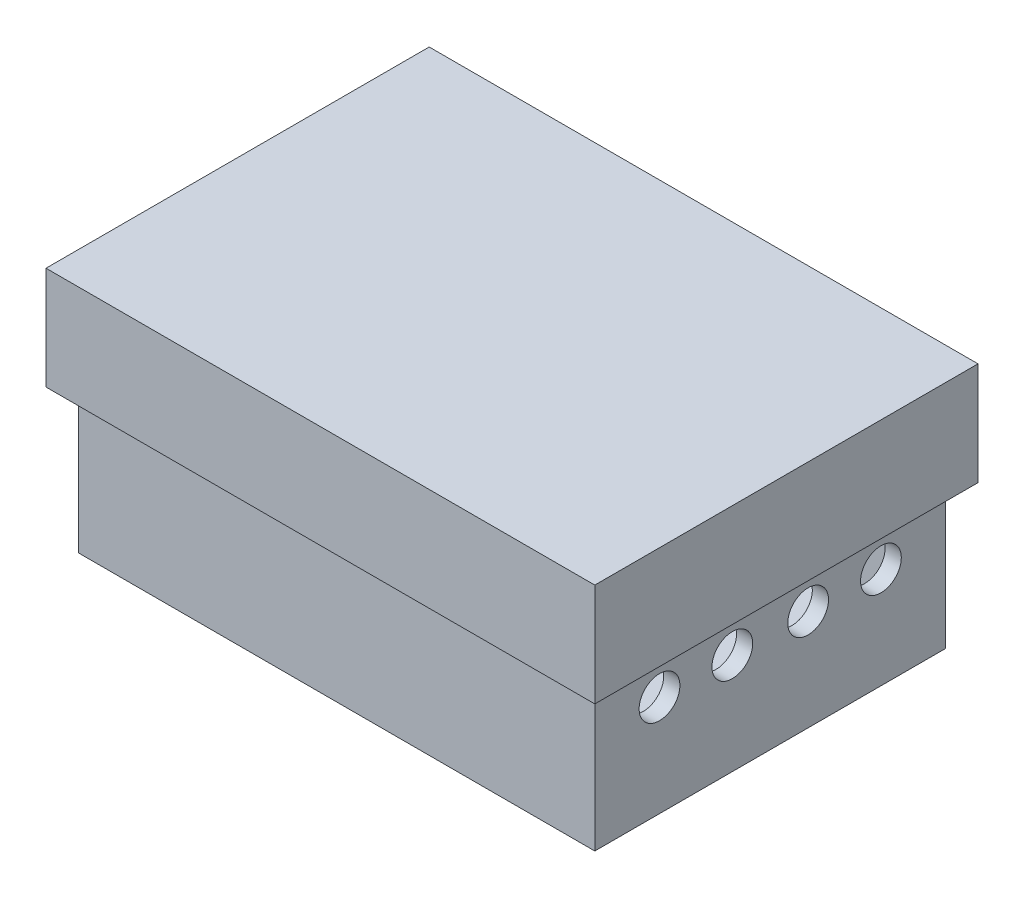
ISO-10303-21;
HEADER;
FILE_DESCRIPTION(('STEP AP214'),'2;1');
FILE_NAME('part.step','',(''),(''),'','','');
FILE_SCHEMA(('AUTOMOTIVE_DESIGN { 1 0 10303 214 1 1 1 1 }'));
ENDSEC;
DATA;
#1=APPLICATION_CONTEXT('core data for automotive mechanical design processes');
#2=APPLICATION_PROTOCOL_DEFINITION('international standard','automotive_design',2000,#1);
#3=PRODUCT_CONTEXT('',#1,'mechanical');
#4=PRODUCT('Part','Part','',(#3));
#5=PRODUCT_RELATED_PRODUCT_CATEGORY('part','',(#4));
#6=PRODUCT_DEFINITION_FORMATION('','',#4);
#7=PRODUCT_DEFINITION_CONTEXT('part definition',#1,'design');
#8=PRODUCT_DEFINITION('design','',#6,#7);
#9=PRODUCT_DEFINITION_SHAPE('','',#8);
#10=(LENGTH_UNIT() NAMED_UNIT(*) SI_UNIT(.MILLI.,.METRE.));
#11=(NAMED_UNIT(*) PLANE_ANGLE_UNIT() SI_UNIT($,.RADIAN.));
#12=(NAMED_UNIT(*) SI_UNIT($,.STERADIAN.) SOLID_ANGLE_UNIT());
#13=UNCERTAINTY_MEASURE_WITH_UNIT(LENGTH_MEASURE(1.E-05),#10,'distance_accuracy_value','');
#14=(GEOMETRIC_REPRESENTATION_CONTEXT(3) GLOBAL_UNCERTAINTY_ASSIGNED_CONTEXT((#13)) GLOBAL_UNIT_ASSIGNED_CONTEXT((#10,
#11,#12)) REPRESENTATION_CONTEXT('',''));
#15=CARTESIAN_POINT('',(0.,0.,0.));
#16=DIRECTION('',(0.,0.,1.));
#17=DIRECTION('',(1.,0.,0.));
#18=AXIS2_PLACEMENT_3D('',#15,#16,#17);
#19=CARTESIAN_POINT('',(101.35,65.,-68.85));
#20=DIRECTION('',(-1.,0.,0.));
#21=DIRECTION('',(0.,0.,1.));
#22=AXIS2_PLACEMENT_3D('',#19,#20,#21);
#23=PLANE('',#22);
#24=CARTESIAN_POINT('',(101.35,33.25,-14.875));
#25=DIRECTION('',(1.,0.,0.));
#26=DIRECTION('',(0.,0.,-1.));
#27=AXIS2_PLACEMENT_3D('',#24,#25,#26);
#28=CIRCLE('',#27,8.);
#29=CARTESIAN_POINT('',(101.35,33.25,-22.875));
#30=VERTEX_POINT('',#29);
#31=EDGE_CURVE('E197',#30,#30,#28,.T.);
#32=ORIENTED_EDGE('',*,*,#31,.F.);
#33=EDGE_LOOP('',(#32));
#34=FACE_BOUND('',#33,.T.);
#35=CARTESIAN_POINT('',(101.35,33.25,-43.45));
#36=DIRECTION('',(1.,0.,0.));
#37=DIRECTION('',(0.,0.,-1.));
#38=AXIS2_PLACEMENT_3D('',#35,#36,#37);
#39=CIRCLE('',#38,8.);
#40=CARTESIAN_POINT('',(101.35,33.25,-51.45));
#41=VERTEX_POINT('',#40);
#42=EDGE_CURVE('E198',#41,#41,#39,.T.);
#43=ORIENTED_EDGE('',*,*,#42,.F.);
#44=EDGE_LOOP('',(#43));
#45=FACE_BOUND('',#44,.T.);
#46=CARTESIAN_POINT('',(101.35,33.25,14.875));
#47=DIRECTION('',(-1.,0.,0.));
#48=DIRECTION('',(0.,0.,1.));
#49=AXIS2_PLACEMENT_3D('',#46,#47,#48);
#50=CIRCLE('',#49,8.);
#51=CARTESIAN_POINT('',(101.35,33.25,22.875));
#52=VERTEX_POINT('',#51);
#53=EDGE_CURVE('E209',#52,#52,#50,.T.);
#54=ORIENTED_EDGE('',*,*,#53,.T.);
#55=EDGE_LOOP('',(#54));
#56=FACE_BOUND('',#55,.T.);
#57=CARTESIAN_POINT('',(101.35,33.25,43.45));
#58=DIRECTION('',(-1.,0.,0.));
#59=DIRECTION('',(0.,0.,1.));
#60=AXIS2_PLACEMENT_3D('',#57,#58,#59);
#61=CIRCLE('',#60,8.);
#62=CARTESIAN_POINT('',(101.35,33.25,51.45));
#63=VERTEX_POINT('',#62);
#64=EDGE_CURVE('E202',#63,#63,#61,.T.);
#65=ORIENTED_EDGE('',*,*,#64,.T.);
#66=EDGE_LOOP('',(#65));
#67=FACE_BOUND('',#66,.T.);
#68=DIRECTION('',(0.,-1.,0.));
#69=VECTOR('',#68,1.);
#70=CARTESIAN_POINT('',(101.35,65.,-68.85));
#71=LINE('',#70,#69);
#72=CARTESIAN_POINT('',(101.35,50.,-68.85));
#73=VERTEX_POINT('',#72);
#74=CARTESIAN_POINT('',(101.35,-6.35,-68.85));
#75=VERTEX_POINT('',#74);
#76=EDGE_CURVE('E11',#73,#75,#71,.T.);
#77=ORIENTED_EDGE('',*,*,#76,.F.);
#78=DIRECTION('',(0.,0.,-1.));
#79=VECTOR('',#78,1.);
#80=CARTESIAN_POINT('',(101.35,50.,68.85));
#81=LINE('',#80,#79);
#82=CARTESIAN_POINT('',(101.35,50.,68.85));
#83=VERTEX_POINT('',#82);
#84=EDGE_CURVE('E166',#83,#73,#81,.T.);
#85=ORIENTED_EDGE('',*,*,#84,.F.);
#86=DIRECTION('',(0.,-1.,0.));
#87=VECTOR('',#86,1.);
#88=CARTESIAN_POINT('',(101.35,65.,68.85));
#89=LINE('',#88,#87);
#90=CARTESIAN_POINT('',(101.35,-6.35,68.85));
#91=VERTEX_POINT('',#90);
#92=EDGE_CURVE('E283',#83,#91,#89,.T.);
#93=ORIENTED_EDGE('',*,*,#92,.T.);
#94=DIRECTION('',(0.,0.,1.));
#95=VECTOR('',#94,1.);
#96=CARTESIAN_POINT('',(101.35,-6.35,68.85));
#97=LINE('',#96,#95);
#98=EDGE_CURVE('E232',#75,#91,#97,.T.);
#99=ORIENTED_EDGE('',*,*,#98,.F.);
#100=EDGE_LOOP('',(#77,#85,#93,#99));
#101=FACE_BOUND('',#100,.T.);
#102=ADVANCED_FACE('F39',(#34,#45,#56,#67,#101),#23,.F.);
#103=CARTESIAN_POINT('',(-101.35,65.,-68.85));
#104=DIRECTION('',(0.,0.,1.));
#105=DIRECTION('',(1.,0.,0.));
#106=AXIS2_PLACEMENT_3D('',#103,#104,#105);
#107=PLANE('',#106);
#108=DIRECTION('',(0.,-1.,0.));
#109=VECTOR('',#108,1.);
#110=CARTESIAN_POINT('',(-101.35,65.,-68.85));
#111=LINE('',#110,#109);
#112=CARTESIAN_POINT('',(-101.35,50.,-68.85));
#113=VERTEX_POINT('',#112);
#114=CARTESIAN_POINT('',(-101.35,-6.35,-68.85));
#115=VERTEX_POINT('',#114);
#116=EDGE_CURVE('E47',#113,#115,#111,.T.);
#117=ORIENTED_EDGE('',*,*,#116,.F.);
#118=DIRECTION('',(-1.,0.,0.));
#119=VECTOR('',#118,1.);
#120=CARTESIAN_POINT('',(101.35,50.,-68.85));
#121=LINE('',#120,#119);
#122=EDGE_CURVE('E169',#73,#113,#121,.T.);
#123=ORIENTED_EDGE('',*,*,#122,.F.);
#124=ORIENTED_EDGE('',*,*,#76,.T.);
#125=DIRECTION('',(1.,0.,0.));
#126=VECTOR('',#125,1.);
#127=CARTESIAN_POINT('',(101.35,-6.35,-68.85));
#128=LINE('',#127,#126);
#129=EDGE_CURVE('E228',#115,#75,#128,.T.);
#130=ORIENTED_EDGE('',*,*,#129,.F.);
#131=EDGE_LOOP('',(#117,#123,#124,#130));
#132=FACE_BOUND('',#131,.T.);
#133=ADVANCED_FACE('F297',(#132),#107,.F.);
#134=CARTESIAN_POINT('',(-101.35,65.,-68.85));
#135=DIRECTION('',(1.,0.,0.));
#136=DIRECTION('',(0.,0.,-1.));
#137=AXIS2_PLACEMENT_3D('',#134,#135,#136);
#138=PLANE('',#137);
#139=DIRECTION('',(0.,-1.,0.));
#140=VECTOR('',#139,1.);
#141=CARTESIAN_POINT('',(-101.35,65.,68.85));
#142=LINE('',#141,#140);
#143=CARTESIAN_POINT('',(-101.35,50.,68.85));
#144=VERTEX_POINT('',#143);
#145=CARTESIAN_POINT('',(-101.35,-6.35,68.85));
#146=VERTEX_POINT('',#145);
#147=EDGE_CURVE('E286',#144,#146,#142,.T.);
#148=ORIENTED_EDGE('',*,*,#147,.F.);
#149=DIRECTION('',(0.,0.,1.));
#150=VECTOR('',#149,1.);
#151=CARTESIAN_POINT('',(-101.35,50.,-68.85));
#152=LINE('',#151,#150);
#153=EDGE_CURVE('E54',#113,#144,#152,.T.);
#154=ORIENTED_EDGE('',*,*,#153,.F.);
#155=ORIENTED_EDGE('',*,*,#116,.T.);
#156=DIRECTION('',(0.,0.,-1.));
#157=VECTOR('',#156,1.);
#158=CARTESIAN_POINT('',(-101.35,-6.35,-68.85));
#159=LINE('',#158,#157);
#160=EDGE_CURVE('E218',#146,#115,#159,.T.);
#161=ORIENTED_EDGE('',*,*,#160,.F.);
#162=EDGE_LOOP('',(#148,#154,#155,#161));
#163=FACE_BOUND('',#162,.T.);
#164=ADVANCED_FACE('F294',(#163),#138,.F.);
#165=CARTESIAN_POINT('',(-101.35,65.,68.85));
#166=DIRECTION('',(0.,0.,-1.));
#167=DIRECTION('',(-1.,0.,0.));
#168=AXIS2_PLACEMENT_3D('',#165,#166,#167);
#169=PLANE('',#168);
#170=ORIENTED_EDGE('',*,*,#92,.F.);
#171=DIRECTION('',(1.,0.,0.));
#172=VECTOR('',#171,1.);
#173=CARTESIAN_POINT('',(-101.35,50.,68.85));
#174=LINE('',#173,#172);
#175=EDGE_CURVE('E163',#144,#83,#174,.T.);
#176=ORIENTED_EDGE('',*,*,#175,.F.);
#177=ORIENTED_EDGE('',*,*,#147,.T.);
#178=DIRECTION('',(-1.,0.,0.));
#179=VECTOR('',#178,1.);
#180=CARTESIAN_POINT('',(-101.35,-6.35,68.85));
#181=LINE('',#180,#179);
#182=EDGE_CURVE('E236',#91,#146,#181,.T.);
#183=ORIENTED_EDGE('',*,*,#182,.F.);
#184=EDGE_LOOP('',(#170,#176,#177,#183));
#185=FACE_BOUND('',#184,.T.);
#186=ADVANCED_FACE('F305',(#185),#169,.F.);
#187=CARTESIAN_POINT('',(94.9999999999999,65.,-62.4999999999998));
#188=DIRECTION('',(-1.,0.,0.));
#189=DIRECTION('',(0.,0.,1.));
#190=AXIS2_PLACEMENT_3D('',#187,#188,#189);
#191=PLANE('',#190);
#192=CARTESIAN_POINT('',(94.9999999999999,33.25,-14.875));
#193=DIRECTION('',(-1.,0.,0.));
#194=DIRECTION('',(0.,0.,1.));
#195=AXIS2_PLACEMENT_3D('',#192,#193,#194);
#196=CIRCLE('',#195,8.);
#197=CARTESIAN_POINT('',(94.9999999999999,33.25,-6.87499999999999));
#198=VERTEX_POINT('',#197);
#199=EDGE_CURVE('E193',#198,#198,#196,.F.);
#200=ORIENTED_EDGE('',*,*,#199,.T.);
#201=EDGE_LOOP('',(#200));
#202=FACE_BOUND('',#201,.T.);
#203=CARTESIAN_POINT('',(94.9999999999999,33.25,-43.45));
#204=DIRECTION('',(-1.,0.,0.));
#205=DIRECTION('',(0.,0.,1.));
#206=AXIS2_PLACEMENT_3D('',#203,#204,#205);
#207=CIRCLE('',#206,8.);
#208=CARTESIAN_POINT('',(94.9999999999999,33.25,-35.45));
#209=VERTEX_POINT('',#208);
#210=EDGE_CURVE('E187',#209,#209,#207,.F.);
#211=ORIENTED_EDGE('',*,*,#210,.T.);
#212=EDGE_LOOP('',(#211));
#213=FACE_BOUND('',#212,.T.);
#214=CARTESIAN_POINT('',(94.9999999999999,33.25,14.875));
#215=DIRECTION('',(-1.,0.,0.));
#216=DIRECTION('',(0.,0.,1.));
#217=AXIS2_PLACEMENT_3D('',#214,#215,#216);
#218=CIRCLE('',#217,8.);
#219=CARTESIAN_POINT('',(94.9999999999999,33.25,22.875));
#220=VERTEX_POINT('',#219);
#221=EDGE_CURVE('E213',#220,#220,#218,.T.);
#222=ORIENTED_EDGE('',*,*,#221,.F.);
#223=EDGE_LOOP('',(#222));
#224=FACE_BOUND('',#223,.T.);
#225=CARTESIAN_POINT('',(94.9999999999999,33.25,43.45));
#226=DIRECTION('',(-1.,0.,0.));
#227=DIRECTION('',(0.,0.,1.));
#228=AXIS2_PLACEMENT_3D('',#225,#226,#227);
#229=CIRCLE('',#228,8.);
#230=CARTESIAN_POINT('',(94.9999999999999,33.25,51.45));
#231=VERTEX_POINT('',#230);
#232=EDGE_CURVE('E214',#231,#231,#229,.T.);
#233=ORIENTED_EDGE('',*,*,#232,.F.);
#234=EDGE_LOOP('',(#233));
#235=FACE_BOUND('',#234,.T.);
#236=DIRECTION('',(0.,0.,-1.));
#237=VECTOR('',#236,1.);
#238=CARTESIAN_POINT('',(94.9999999999999,0.,-62.4999999999998));
#239=LINE('',#238,#237);
#240=CARTESIAN_POINT('',(94.9999999999999,0.,62.5000000000002));
#241=VERTEX_POINT('',#240);
#242=CARTESIAN_POINT('',(94.9999999999999,0.,-62.4999999999998));
#243=VERTEX_POINT('',#242);
#244=EDGE_CURVE('E240',#241,#243,#239,.T.);
#245=ORIENTED_EDGE('',*,*,#244,.F.);
#246=DIRECTION('',(0.,-1.,0.));
#247=VECTOR('',#246,1.);
#248=CARTESIAN_POINT('',(94.9999999999999,65.,62.5000000000002));
#249=LINE('',#248,#247);
#250=CARTESIAN_POINT('',(94.9999999999999,65.,62.5000000000002));
#251=VERTEX_POINT('',#250);
#252=EDGE_CURVE('E256',#251,#241,#249,.T.);
#253=ORIENTED_EDGE('',*,*,#252,.F.);
#254=DIRECTION('',(0.,0.,-1.));
#255=VECTOR('',#254,1.);
#256=CARTESIAN_POINT('',(94.9999999999999,65.,-62.4999999999998));
#257=LINE('',#256,#255);
#258=CARTESIAN_POINT('',(94.9999999999999,65.,-62.4999999999998));
#259=VERTEX_POINT('',#258);
#260=EDGE_CURVE('E241',#251,#259,#257,.T.);
#261=ORIENTED_EDGE('',*,*,#260,.T.);
#262=DIRECTION('',(0.,-1.,0.));
#263=VECTOR('',#262,1.);
#264=CARTESIAN_POINT('',(94.9999999999999,65.,-62.4999999999998));
#265=LINE('',#264,#263);
#266=EDGE_CURVE('E279',#259,#243,#265,.T.);
#267=ORIENTED_EDGE('',*,*,#266,.T.);
#268=EDGE_LOOP('',(#245,#253,#261,#267));
#269=FACE_BOUND('',#268,.T.);
#270=ADVANCED_FACE('F354',(#202,#213,#224,#235,#269),#191,.T.);
#271=CARTESIAN_POINT('',(-95.0000000000001,65.,-62.4999999999998));
#272=DIRECTION('',(0.,0.,1.));
#273=DIRECTION('',(1.,0.,0.));
#274=AXIS2_PLACEMENT_3D('',#271,#272,#273);
#275=PLANE('',#274);
#276=DIRECTION('',(-1.,0.,0.));
#277=VECTOR('',#276,1.);
#278=CARTESIAN_POINT('',(-95.0000000000001,0.,-62.4999999999998));
#279=LINE('',#278,#277);
#280=CARTESIAN_POINT('',(-95.0000000000001,0.,-62.4999999999998));
#281=VERTEX_POINT('',#280);
#282=EDGE_CURVE('E260',#243,#281,#279,.T.);
#283=ORIENTED_EDGE('',*,*,#282,.F.);
#284=ORIENTED_EDGE('',*,*,#266,.F.);
#285=DIRECTION('',(-1.,0.,0.));
#286=VECTOR('',#285,1.);
#287=CARTESIAN_POINT('',(-95.0000000000001,65.,-62.4999999999998));
#288=LINE('',#287,#286);
#289=CARTESIAN_POINT('',(-95.0000000000001,65.,-62.4999999999998));
#290=VERTEX_POINT('',#289);
#291=EDGE_CURVE('E245',#259,#290,#288,.T.);
#292=ORIENTED_EDGE('',*,*,#291,.T.);
#293=DIRECTION('',(0.,-1.,0.));
#294=VECTOR('',#293,1.);
#295=CARTESIAN_POINT('',(-95.0000000000001,65.,-62.4999999999998));
#296=LINE('',#295,#294);
#297=EDGE_CURVE('E276',#290,#281,#296,.T.);
#298=ORIENTED_EDGE('',*,*,#297,.T.);
#299=EDGE_LOOP('',(#283,#284,#292,#298));
#300=FACE_BOUND('',#299,.T.);
#301=ADVANCED_FACE('F350',(#300),#275,.T.);
#302=CARTESIAN_POINT('',(-95.0000000000001,65.,-62.4999999999998));
#303=DIRECTION('',(1.,0.,0.));
#304=DIRECTION('',(0.,0.,-1.));
#305=AXIS2_PLACEMENT_3D('',#302,#303,#304);
#306=PLANE('',#305);
#307=DIRECTION('',(0.,0.,1.));
#308=VECTOR('',#307,1.);
#309=CARTESIAN_POINT('',(-95.0000000000001,0.,-62.4999999999998));
#310=LINE('',#309,#308);
#311=CARTESIAN_POINT('',(-95.0000000000001,0.,62.5000000000002));
#312=VERTEX_POINT('',#311);
#313=EDGE_CURVE('E264',#281,#312,#310,.T.);
#314=ORIENTED_EDGE('',*,*,#313,.F.);
#315=ORIENTED_EDGE('',*,*,#297,.F.);
#316=DIRECTION('',(0.,0.,1.));
#317=VECTOR('',#316,1.);
#318=CARTESIAN_POINT('',(-95.0000000000001,65.,-62.4999999999998));
#319=LINE('',#318,#317);
#320=CARTESIAN_POINT('',(-95.0000000000001,65.,62.5000000000002));
#321=VERTEX_POINT('',#320);
#322=EDGE_CURVE('E250',#290,#321,#319,.T.);
#323=ORIENTED_EDGE('',*,*,#322,.T.);
#324=DIRECTION('',(0.,-1.,0.));
#325=VECTOR('',#324,1.);
#326=CARTESIAN_POINT('',(-95.0000000000001,65.,62.5000000000002));
#327=LINE('',#326,#325);
#328=EDGE_CURVE('E273',#321,#312,#327,.T.);
#329=ORIENTED_EDGE('',*,*,#328,.T.);
#330=EDGE_LOOP('',(#314,#315,#323,#329));
#331=FACE_BOUND('',#330,.T.);
#332=ADVANCED_FACE('F346',(#331),#306,.T.);
#333=CARTESIAN_POINT('',(-95.0000000000001,65.,62.5000000000002));
#334=DIRECTION('',(0.,0.,-1.));
#335=DIRECTION('',(-1.,0.,0.));
#336=AXIS2_PLACEMENT_3D('',#333,#334,#335);
#337=PLANE('',#336);
#338=DIRECTION('',(1.,0.,0.));
#339=VECTOR('',#338,1.);
#340=CARTESIAN_POINT('',(-95.0000000000001,0.,62.5000000000002));
#341=LINE('',#340,#339);
#342=EDGE_CURVE('E246',#312,#241,#341,.T.);
#343=ORIENTED_EDGE('',*,*,#342,.F.);
#344=ORIENTED_EDGE('',*,*,#328,.F.);
#345=DIRECTION('',(1.,0.,0.));
#346=VECTOR('',#345,1.);
#347=CARTESIAN_POINT('',(-95.0000000000001,65.,62.5000000000002));
#348=LINE('',#347,#346);
#349=EDGE_CURVE('E62',#321,#251,#348,.T.);
#350=ORIENTED_EDGE('',*,*,#349,.T.);
#351=ORIENTED_EDGE('',*,*,#252,.T.);
#352=EDGE_LOOP('',(#343,#344,#350,#351));
#353=FACE_BOUND('',#352,.T.);
#354=ADVANCED_FACE('F342',(#353),#337,.T.);
#355=CARTESIAN_POINT('',(0.,0.,0.));
#356=DIRECTION('',(0.,1.,0.));
#357=DIRECTION('',(0.,0.,1.));
#358=AXIS2_PLACEMENT_3D('',#355,#356,#357);
#359=PLANE('',#358);
#360=ORIENTED_EDGE('',*,*,#342,.T.);
#361=ORIENTED_EDGE('',*,*,#244,.T.);
#362=ORIENTED_EDGE('',*,*,#282,.T.);
#363=ORIENTED_EDGE('',*,*,#313,.T.);
#364=EDGE_LOOP('',(#360,#361,#362,#363));
#365=FACE_BOUND('',#364,.T.);
#366=ADVANCED_FACE('F336',(#365),#359,.T.);
#367=CARTESIAN_POINT('',(0.,-6.35,0.));
#368=DIRECTION('',(0.,1.,0.));
#369=DIRECTION('',(0.,0.,1.));
#370=AXIS2_PLACEMENT_3D('',#367,#368,#369);
#371=PLANE('',#370);
#372=ORIENTED_EDGE('',*,*,#160,.T.);
#373=ORIENTED_EDGE('',*,*,#129,.T.);
#374=ORIENTED_EDGE('',*,*,#98,.T.);
#375=ORIENTED_EDGE('',*,*,#182,.T.);
#376=EDGE_LOOP('',(#372,#373,#374,#375));
#377=FACE_BOUND('',#376,.T.);
#378=ADVANCED_FACE('F301',(#377),#371,.F.);
#379=CARTESIAN_POINT('',(-101.351,33.25,43.45));
#380=DIRECTION('',(1.,0.,0.));
#381=DIRECTION('',(0.,0.,-1.));
#382=AXIS2_PLACEMENT_3D('',#379,#380,#381);
#383=CYLINDRICAL_SURFACE('',#382,8.);
#384=ORIENTED_EDGE('',*,*,#232,.T.);
#385=EDGE_LOOP('',(#384));
#386=FACE_BOUND('',#385,.T.);
#387=ORIENTED_EDGE('',*,*,#64,.F.);
#388=EDGE_LOOP('',(#387));
#389=FACE_BOUND('',#388,.T.);
#390=ADVANCED_FACE('F324',(#386,#389),#383,.F.);
#391=CARTESIAN_POINT('',(-101.351,33.25,14.875));
#392=DIRECTION('',(1.,0.,0.));
#393=DIRECTION('',(0.,0.,-1.));
#394=AXIS2_PLACEMENT_3D('',#391,#392,#393);
#395=CYLINDRICAL_SURFACE('',#394,8.);
#396=ORIENTED_EDGE('',*,*,#221,.T.);
#397=EDGE_LOOP('',(#396));
#398=FACE_BOUND('',#397,.T.);
#399=ORIENTED_EDGE('',*,*,#53,.F.);
#400=EDGE_LOOP('',(#399));
#401=FACE_BOUND('',#400,.T.);
#402=ADVANCED_FACE('F326',(#398,#401),#395,.F.);
#403=CARTESIAN_POINT('',(-101.351,33.25,-43.45));
#404=DIRECTION('',(1.,0.,0.));
#405=DIRECTION('',(0.,0.,-1.));
#406=AXIS2_PLACEMENT_3D('',#403,#404,#405);
#407=CYLINDRICAL_SURFACE('',#406,8.);
#408=ORIENTED_EDGE('',*,*,#210,.F.);
#409=EDGE_LOOP('',(#408));
#410=FACE_BOUND('',#409,.T.);
#411=ORIENTED_EDGE('',*,*,#42,.T.);
#412=EDGE_LOOP('',(#411));
#413=FACE_BOUND('',#412,.T.);
#414=ADVANCED_FACE('F333',(#410,#413),#407,.F.);
#415=CARTESIAN_POINT('',(-101.351,33.25,-14.875));
#416=DIRECTION('',(1.,0.,0.));
#417=DIRECTION('',(0.,0.,-1.));
#418=AXIS2_PLACEMENT_3D('',#415,#416,#417);
#419=CYLINDRICAL_SURFACE('',#418,8.);
#420=ORIENTED_EDGE('',*,*,#199,.F.);
#421=EDGE_LOOP('',(#420));
#422=FACE_BOUND('',#421,.T.);
#423=ORIENTED_EDGE('',*,*,#31,.T.);
#424=EDGE_LOOP('',(#423));
#425=FACE_BOUND('',#424,.T.);
#426=ADVANCED_FACE('F406',(#422,#425),#419,.F.);
#427=CARTESIAN_POINT('',(-107.7,50.,-75.2));
#428=DIRECTION('',(-1.,0.,0.));
#429=DIRECTION('',(0.,0.,1.));
#430=AXIS2_PLACEMENT_3D('',#427,#428,#429);
#431=PLANE('',#430);
#432=DIRECTION('',(0.,1.,0.));
#433=VECTOR('',#432,1.);
#434=CARTESIAN_POINT('',(-107.7,50.,75.2));
#435=LINE('',#434,#433);
#436=CARTESIAN_POINT('',(-107.7,50.,75.2));
#437=VERTEX_POINT('',#436);
#438=CARTESIAN_POINT('',(-107.7,90.4,75.2));
#439=VERTEX_POINT('',#438);
#440=EDGE_CURVE('E185',#437,#439,#435,.T.);
#441=ORIENTED_EDGE('',*,*,#440,.T.);
#442=DIRECTION('',(0.,0.,1.));
#443=VECTOR('',#442,1.);
#444=CARTESIAN_POINT('',(-107.7,90.4,-75.2));
#445=LINE('',#444,#443);
#446=CARTESIAN_POINT('',(-107.7,90.4,-75.2));
#447=VERTEX_POINT('',#446);
#448=EDGE_CURVE('E148',#447,#439,#445,.T.);
#449=ORIENTED_EDGE('',*,*,#448,.F.);
#450=DIRECTION('',(0.,1.,0.));
#451=VECTOR('',#450,1.);
#452=CARTESIAN_POINT('',(-107.7,50.,-75.2));
#453=LINE('',#452,#451);
#454=CARTESIAN_POINT('',(-107.7,50.,-75.2));
#455=VERTEX_POINT('',#454);
#456=EDGE_CURVE('E138',#455,#447,#453,.T.);
#457=ORIENTED_EDGE('',*,*,#456,.F.);
#458=DIRECTION('',(0.,0.,1.));
#459=VECTOR('',#458,1.);
#460=CARTESIAN_POINT('',(-107.7,50.,-75.2));
#461=LINE('',#460,#459);
#462=EDGE_CURVE('E172',#455,#437,#461,.T.);
#463=ORIENTED_EDGE('',*,*,#462,.T.);
#464=EDGE_LOOP('',(#441,#449,#457,#463));
#465=FACE_BOUND('',#464,.T.);
#466=ADVANCED_FACE('F403',(#465),#431,.T.);
#467=CARTESIAN_POINT('',(107.7,50.,-75.2));
#468=DIRECTION('',(0.,0.,-1.));
#469=DIRECTION('',(-1.,0.,0.));
#470=AXIS2_PLACEMENT_3D('',#467,#468,#469);
#471=PLANE('',#470);
#472=ORIENTED_EDGE('',*,*,#456,.T.);
#473=DIRECTION('',(-1.,0.,0.));
#474=VECTOR('',#473,1.);
#475=CARTESIAN_POINT('',(107.7,90.4,-75.2));
#476=LINE('',#475,#474);
#477=CARTESIAN_POINT('',(107.7,90.4,-75.2));
#478=VERTEX_POINT('',#477);
#479=EDGE_CURVE('E142',#478,#447,#476,.T.);
#480=ORIENTED_EDGE('',*,*,#479,.F.);
#481=DIRECTION('',(0.,1.,0.));
#482=VECTOR('',#481,1.);
#483=CARTESIAN_POINT('',(107.7,50.,-75.2));
#484=LINE('',#483,#482);
#485=CARTESIAN_POINT('',(107.7,50.,-75.2));
#486=VERTEX_POINT('',#485);
#487=EDGE_CURVE('E127',#486,#478,#484,.T.);
#488=ORIENTED_EDGE('',*,*,#487,.F.);
#489=DIRECTION('',(-1.,0.,0.));
#490=VECTOR('',#489,1.);
#491=CARTESIAN_POINT('',(107.7,50.,-75.2));
#492=LINE('',#491,#490);
#493=EDGE_CURVE('E182',#486,#455,#492,.T.);
#494=ORIENTED_EDGE('',*,*,#493,.T.);
#495=EDGE_LOOP('',(#472,#480,#488,#494));
#496=FACE_BOUND('',#495,.T.);
#497=ADVANCED_FACE('F143',(#496),#471,.T.);
#498=CARTESIAN_POINT('',(107.7,50.,-75.2));
#499=DIRECTION('',(1.,0.,0.));
#500=DIRECTION('',(0.,0.,-1.));
#501=AXIS2_PLACEMENT_3D('',#498,#499,#500);
#502=PLANE('',#501);
#503=ORIENTED_EDGE('',*,*,#487,.T.);
#504=DIRECTION('',(0.,0.,-1.));
#505=VECTOR('',#504,1.);
#506=CARTESIAN_POINT('',(107.7,90.4,75.2));
#507=LINE('',#506,#505);
#508=CARTESIAN_POINT('',(107.7,90.4,75.2));
#509=VERTEX_POINT('',#508);
#510=EDGE_CURVE('E131',#509,#478,#507,.T.);
#511=ORIENTED_EDGE('',*,*,#510,.F.);
#512=DIRECTION('',(0.,1.,0.));
#513=VECTOR('',#512,1.);
#514=CARTESIAN_POINT('',(107.7,50.,75.2));
#515=LINE('',#514,#513);
#516=CARTESIAN_POINT('',(107.7,50.,75.2));
#517=VERTEX_POINT('',#516);
#518=EDGE_CURVE('E139',#517,#509,#515,.T.);
#519=ORIENTED_EDGE('',*,*,#518,.F.);
#520=DIRECTION('',(0.,0.,-1.));
#521=VECTOR('',#520,1.);
#522=CARTESIAN_POINT('',(107.7,50.,-75.2));
#523=LINE('',#522,#521);
#524=EDGE_CURVE('E133',#517,#486,#523,.T.);
#525=ORIENTED_EDGE('',*,*,#524,.T.);
#526=EDGE_LOOP('',(#503,#511,#519,#525));
#527=FACE_BOUND('',#526,.T.);
#528=ADVANCED_FACE('F129',(#527),#502,.T.);
#529=CARTESIAN_POINT('',(107.7,50.,75.2));
#530=DIRECTION('',(0.,0.,1.));
#531=DIRECTION('',(1.,0.,0.));
#532=AXIS2_PLACEMENT_3D('',#529,#530,#531);
#533=PLANE('',#532);
#534=ORIENTED_EDGE('',*,*,#518,.T.);
#535=DIRECTION('',(1.,0.,0.));
#536=VECTOR('',#535,1.);
#537=CARTESIAN_POINT('',(-107.7,90.4,75.2));
#538=LINE('',#537,#536);
#539=EDGE_CURVE('E153',#439,#509,#538,.T.);
#540=ORIENTED_EDGE('',*,*,#539,.F.);
#541=ORIENTED_EDGE('',*,*,#440,.F.);
#542=DIRECTION('',(1.,0.,0.));
#543=VECTOR('',#542,1.);
#544=CARTESIAN_POINT('',(107.7,50.,75.2));
#545=LINE('',#544,#543);
#546=EDGE_CURVE('E176',#437,#517,#545,.T.);
#547=ORIENTED_EDGE('',*,*,#546,.T.);
#548=EDGE_LOOP('',(#534,#540,#541,#547));
#549=FACE_BOUND('',#548,.T.);
#550=ADVANCED_FACE('F378',(#549),#533,.T.);
#551=CARTESIAN_POINT('',(0.,50.,0.));
#552=DIRECTION('',(0.,-1.,0.));
#553=DIRECTION('',(0.,0.,-1.));
#554=AXIS2_PLACEMENT_3D('',#551,#552,#553);
#555=PLANE('',#554);
#556=ORIENTED_EDGE('',*,*,#153,.T.);
#557=ORIENTED_EDGE('',*,*,#175,.T.);
#558=ORIENTED_EDGE('',*,*,#84,.T.);
#559=ORIENTED_EDGE('',*,*,#122,.T.);
#560=EDGE_LOOP('',(#556,#557,#558,#559));
#561=FACE_BOUND('',#560,.T.);
#562=ORIENTED_EDGE('',*,*,#462,.F.);
#563=ORIENTED_EDGE('',*,*,#493,.F.);
#564=ORIENTED_EDGE('',*,*,#524,.F.);
#565=ORIENTED_EDGE('',*,*,#546,.F.);
#566=EDGE_LOOP('',(#562,#563,#564,#565));
#567=FACE_BOUND('',#566,.T.);
#568=ADVANCED_FACE('F307',(#561,#567),#555,.T.);
#569=CARTESIAN_POINT('',(0.,65.,0.));
#570=DIRECTION('',(0.,1.,0.));
#571=DIRECTION('',(0.,0.,1.));
#572=AXIS2_PLACEMENT_3D('',#569,#570,#571);
#573=PLANE('',#572);
#574=ORIENTED_EDGE('',*,*,#291,.F.);
#575=ORIENTED_EDGE('',*,*,#260,.F.);
#576=ORIENTED_EDGE('',*,*,#349,.F.);
#577=ORIENTED_EDGE('',*,*,#322,.F.);
#578=EDGE_LOOP('',(#574,#575,#576,#577));
#579=FACE_BOUND('',#578,.T.);
#580=ADVANCED_FACE('F377',(#579),#573,.F.);
#581=CARTESIAN_POINT('',(0.,90.4,0.));
#582=DIRECTION('',(0.,1.,0.));
#583=DIRECTION('',(0.,0.,1.));
#584=AXIS2_PLACEMENT_3D('',#581,#582,#583);
#585=PLANE('',#584);
#586=ORIENTED_EDGE('',*,*,#510,.T.);
#587=ORIENTED_EDGE('',*,*,#479,.T.);
#588=ORIENTED_EDGE('',*,*,#448,.T.);
#589=ORIENTED_EDGE('',*,*,#539,.T.);
#590=EDGE_LOOP('',(#586,#587,#588,#589));
#591=FACE_BOUND('',#590,.T.);
#592=ADVANCED_FACE('F151',(#591),#585,.T.);
#593=CLOSED_SHELL('',(#102,#133,#164,#186,#270,#301,#332,#354,#366,#378,#390,#402,#414,#426,
#466,#497,#528,#550,#568,#580,#592));
#594=MANIFOLD_SOLID_BREP('B2',#593);
#595=ADVANCED_BREP_SHAPE_REPRESENTATION('',(#18,#594),#14);
#596=SHAPE_DEFINITION_REPRESENTATION(#9,#595);
ENDSEC;
END-ISO-10303-21;
